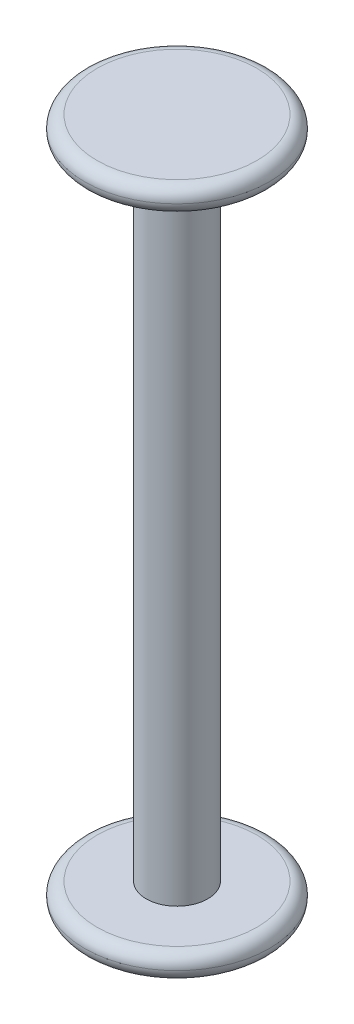
ISO-10303-21;
HEADER;
FILE_DESCRIPTION(('STEP AP214'),'2;1');
FILE_NAME('part.step','',(''),(''),'','','');
FILE_SCHEMA(('AUTOMOTIVE_DESIGN { 1 0 10303 214 1 1 1 1 }'));
ENDSEC;
DATA;
#1=APPLICATION_CONTEXT('core data for automotive mechanical design processes');
#2=APPLICATION_PROTOCOL_DEFINITION('international standard','automotive_design',2000,#1);
#3=PRODUCT_CONTEXT('',#1,'mechanical');
#4=PRODUCT('Part','Part','',(#3));
#5=PRODUCT_RELATED_PRODUCT_CATEGORY('part','',(#4));
#6=PRODUCT_DEFINITION_FORMATION('','',#4);
#7=PRODUCT_DEFINITION_CONTEXT('part definition',#1,'design');
#8=PRODUCT_DEFINITION('design','',#6,#7);
#9=PRODUCT_DEFINITION_SHAPE('','',#8);
#10=(LENGTH_UNIT() NAMED_UNIT(*) SI_UNIT(.MILLI.,.METRE.));
#11=(NAMED_UNIT(*) PLANE_ANGLE_UNIT() SI_UNIT($,.RADIAN.));
#12=(NAMED_UNIT(*) SI_UNIT($,.STERADIAN.) SOLID_ANGLE_UNIT());
#13=UNCERTAINTY_MEASURE_WITH_UNIT(LENGTH_MEASURE(1.E-05),#10,'distance_accuracy_value','');
#14=(GEOMETRIC_REPRESENTATION_CONTEXT(3) GLOBAL_UNCERTAINTY_ASSIGNED_CONTEXT((#13)) GLOBAL_UNIT_ASSIGNED_CONTEXT((#10,
#11,#12)) REPRESENTATION_CONTEXT('',''));
#15=CARTESIAN_POINT('',(0.,0.,0.));
#16=DIRECTION('',(0.,0.,1.));
#17=DIRECTION('',(1.,0.,0.));
#18=AXIS2_PLACEMENT_3D('',#15,#16,#17);
#19=CARTESIAN_POINT('',(0.,26.,0.));
#20=DIRECTION('',(0.,-1.,0.));
#21=DIRECTION('',(0.,0.,-1.));
#22=AXIS2_PLACEMENT_3D('',#19,#20,#21);
#23=CYLINDRICAL_SURFACE('',#22,2.5);
#24=CARTESIAN_POINT('',(0.,26.,0.));
#25=DIRECTION('',(0.,1.,0.));
#26=DIRECTION('',(0.,0.,1.));
#27=AXIS2_PLACEMENT_3D('',#24,#25,#26);
#28=CIRCLE('',#27,2.5);
#29=CARTESIAN_POINT('',(0.,26.,-2.5));
#30=VERTEX_POINT('',#29);
#31=EDGE_CURVE('E43',#30,#30,#28,.T.);
#32=CARTESIAN_POINT('',(0.,-26.,0.));
#33=DIRECTION('',(0.,1.,0.));
#34=DIRECTION('',(0.,0.,1.));
#35=AXIS2_PLACEMENT_3D('',#32,#33,#34);
#36=CIRCLE('',#35,2.5);
#37=CARTESIAN_POINT('',(0.,-26.,-2.5));
#38=VERTEX_POINT('',#37);
#39=EDGE_CURVE('E51',#38,#38,#36,.T.);
#40=CARTESIAN_POINT('',(0.,26.,-2.5));
#41=CARTESIAN_POINT('',(0.,25.4583333333333,-2.5));
#42=CARTESIAN_POINT('',(0.,24.9166666666667,-2.5));
#43=CARTESIAN_POINT('',(0.,23.8333333333333,-2.5));
#44=CARTESIAN_POINT('',(0.,23.2916666666667,-2.5));
#45=CARTESIAN_POINT('',(0.,22.2083333333333,-2.5));
#46=CARTESIAN_POINT('',(0.,21.6666666666667,-2.5));
#47=CARTESIAN_POINT('',(0.,20.5833333333333,-2.5));
#48=CARTESIAN_POINT('',(0.,20.0416666666667,-2.5));
#49=CARTESIAN_POINT('',(0.,18.9583333333333,-2.5));
#50=CARTESIAN_POINT('',(0.,18.4166666666667,-2.5));
#51=CARTESIAN_POINT('',(0.,17.3333333333333,-2.5));
#52=CARTESIAN_POINT('',(0.,16.7916666666667,-2.5));
#53=CARTESIAN_POINT('',(0.,15.7083333333333,-2.5));
#54=CARTESIAN_POINT('',(0.,15.1666666666667,-2.5));
#55=CARTESIAN_POINT('',(0.,14.0833333333333,-2.5));
#56=CARTESIAN_POINT('',(0.,13.5416666666667,-2.5));
#57=CARTESIAN_POINT('',(0.,12.4583333333333,-2.5));
#58=CARTESIAN_POINT('',(0.,11.9166666666667,-2.5));
#59=CARTESIAN_POINT('',(0.,10.8333333333333,-2.5));
#60=CARTESIAN_POINT('',(0.,10.2916666666667,-2.5));
#61=CARTESIAN_POINT('',(0.,9.20833333333333,-2.5));
#62=CARTESIAN_POINT('',(0.,8.66666666666667,-2.5));
#63=CARTESIAN_POINT('',(0.,7.58333333333333,-2.5));
#64=CARTESIAN_POINT('',(0.,7.04166666666667,-2.5));
#65=CARTESIAN_POINT('',(0.,5.95833333333333,-2.5));
#66=CARTESIAN_POINT('',(0.,5.41666666666667,-2.5));
#67=CARTESIAN_POINT('',(0.,4.33333333333333,-2.5));
#68=CARTESIAN_POINT('',(0.,3.79166666666667,-2.5));
#69=CARTESIAN_POINT('',(0.,2.70833333333333,-2.5));
#70=CARTESIAN_POINT('',(0.,2.16666666666667,-2.5));
#71=CARTESIAN_POINT('',(0.,1.08333333333333,-2.5));
#72=CARTESIAN_POINT('',(0.,0.541666666666667,-2.5));
#73=CARTESIAN_POINT('',(0.,-0.541666666666667,-2.5));
#74=CARTESIAN_POINT('',(0.,-1.08333333333333,-2.5));
#75=CARTESIAN_POINT('',(0.,-2.16666666666667,-2.5));
#76=CARTESIAN_POINT('',(0.,-2.70833333333333,-2.5));
#77=CARTESIAN_POINT('',(0.,-3.79166666666667,-2.5));
#78=CARTESIAN_POINT('',(0.,-4.33333333333333,-2.5));
#79=CARTESIAN_POINT('',(0.,-5.41666666666667,-2.5));
#80=CARTESIAN_POINT('',(0.,-5.95833333333333,-2.5));
#81=CARTESIAN_POINT('',(0.,-7.04166666666666,-2.5));
#82=CARTESIAN_POINT('',(0.,-7.58333333333333,-2.5));
#83=CARTESIAN_POINT('',(0.,-8.66666666666666,-2.5));
#84=CARTESIAN_POINT('',(0.,-9.20833333333333,-2.5));
#85=CARTESIAN_POINT('',(0.,-10.2916666666667,-2.5));
#86=CARTESIAN_POINT('',(0.,-10.8333333333333,-2.5));
#87=CARTESIAN_POINT('',(0.,-11.9166666666667,-2.5));
#88=CARTESIAN_POINT('',(0.,-12.4583333333333,-2.5));
#89=CARTESIAN_POINT('',(0.,-13.5416666666667,-2.5));
#90=CARTESIAN_POINT('',(0.,-14.0833333333333,-2.5));
#91=CARTESIAN_POINT('',(0.,-15.1666666666667,-2.5));
#92=CARTESIAN_POINT('',(0.,-15.7083333333333,-2.5));
#93=CARTESIAN_POINT('',(0.,-16.7916666666667,-2.5));
#94=CARTESIAN_POINT('',(0.,-17.3333333333333,-2.5));
#95=CARTESIAN_POINT('',(0.,-18.4166666666667,-2.5));
#96=CARTESIAN_POINT('',(0.,-18.9583333333333,-2.5));
#97=CARTESIAN_POINT('',(0.,-20.0416666666667,-2.5));
#98=CARTESIAN_POINT('',(0.,-20.5833333333333,-2.5));
#99=CARTESIAN_POINT('',(0.,-21.6666666666667,-2.5));
#100=CARTESIAN_POINT('',(0.,-22.2083333333333,-2.5));
#101=CARTESIAN_POINT('',(0.,-23.2916666666667,-2.5));
#102=CARTESIAN_POINT('',(0.,-23.8333333333333,-2.5));
#103=CARTESIAN_POINT('',(0.,-24.9166666666667,-2.5));
#104=CARTESIAN_POINT('',(0.,-25.4583333333333,-2.5));
#105=CARTESIAN_POINT('',(0.,-26.,-2.5));
#106=B_SPLINE_CURVE_WITH_KNOTS('',3,(#40,#41,#42,#43,#44,#45,#46,#47,#48,#49,#50,#51,#52,#53,
#54,#55,#56,#57,#58,#59,#60,#61,#62,#63,#64,#65,#66,#67,#68,#69,#70,#71,#72,#73,#74,#75,#76,#77,
#78,#79,#80,#81,#82,#83,#84,#85,#86,#87,#88,#89,#90,#91,#92,#93,#94,#95,#96,#97,#98,#99,#100,
#101,#102,#103,#104,#105),.UNSPECIFIED.,.F.,.F.,(4,2,2,2,2,2,2,2,2,2,2,2,2,2,2,2,2,2,2,2,2,2,2,
2,2,2,2,2,2,2,2,2,4),(0.,1.625,3.25,4.875,6.5,8.125,9.75,11.375,13.,14.625,16.25,17.875,19.5,
21.125,22.75,24.375,26.,27.625,29.25,30.875,32.5,34.125,35.75,37.375,39.,40.625,42.25,43.875,
45.5,47.125,48.75,50.375,52.),.UNSPECIFIED.);
#107=EDGE_CURVE('BSEAM31',#30,#38,#106,.T.);
#108=ORIENTED_EDGE('',*,*,#31,.F.);
#109=ORIENTED_EDGE('',*,*,#39,.T.);
#110=ORIENTED_EDGE('',*,*,#107,.T.);
#111=ORIENTED_EDGE('',*,*,#107,.F.);
#112=EDGE_LOOP('',(#108,#110,#109,#111));
#113=FACE_BOUND('',#112,.T.);
#114=ADVANCED_FACE('F31',(#113),#23,.T.);
#115=CARTESIAN_POINT('',(0.,28.,0.));
#116=DIRECTION('',(0.,1.,0.));
#117=DIRECTION('',(0.,0.,1.));
#118=AXIS2_PLACEMENT_3D('',#115,#116,#117);
#119=PLANE('',#118);
#120=CARTESIAN_POINT('',(0.,28.,0.));
#121=DIRECTION('',(0.,1.,0.));
#122=DIRECTION('',(0.,0.,1.));
#123=AXIS2_PLACEMENT_3D('',#120,#121,#122);
#124=CIRCLE('',#123,6.5);
#125=CARTESIAN_POINT('',(0.,28.,6.5));
#126=VERTEX_POINT('',#125);
#127=EDGE_CURVE('E39',#126,#126,#124,.T.);
#128=ORIENTED_EDGE('',*,*,#127,.T.);
#129=EDGE_LOOP('',(#128));
#130=FACE_BOUND('',#129,.T.);
#131=ADVANCED_FACE('F81',(#130),#119,.T.);
#132=CARTESIAN_POINT('',(0.,26.,0.));
#133=DIRECTION('',(0.,1.,0.));
#134=DIRECTION('',(0.,0.,1.));
#135=AXIS2_PLACEMENT_3D('',#132,#133,#134);
#136=PLANE('',#135);
#137=CARTESIAN_POINT('',(0.,26.,0.));
#138=DIRECTION('',(0.,1.,0.));
#139=DIRECTION('',(0.,0.,1.));
#140=AXIS2_PLACEMENT_3D('',#137,#138,#139);
#141=CIRCLE('',#140,6.5);
#142=CARTESIAN_POINT('',(0.,26.,6.5));
#143=VERTEX_POINT('',#142);
#144=EDGE_CURVE('E10',#143,#143,#141,.F.);
#145=ORIENTED_EDGE('',*,*,#144,.T.);
#146=EDGE_LOOP('',(#145));
#147=FACE_BOUND('',#146,.T.);
#148=ORIENTED_EDGE('',*,*,#31,.T.);
#149=EDGE_LOOP('',(#148));
#150=FACE_BOUND('',#149,.T.);
#151=ADVANCED_FACE('F87',(#147,#150),#136,.F.);
#152=CARTESIAN_POINT('',(0.,27.,0.));
#153=DIRECTION('',(0.,1.,0.));
#154=DIRECTION('',(0.,0.,1.));
#155=AXIS2_PLACEMENT_3D('',#152,#153,#154);
#156=TOROIDAL_SURFACE('',#155,6.5,1.);
#157=ORIENTED_EDGE('',*,*,#144,.F.);
#158=EDGE_LOOP('',(#157));
#159=FACE_BOUND('',#158,.T.);
#160=CARTESIAN_POINT('',(0.,27.,0.));
#161=DIRECTION('',(0.,1.,0.));
#162=DIRECTION('',(0.,0.,1.));
#163=AXIS2_PLACEMENT_3D('',#160,#161,#162);
#164=CIRCLE('',#163,7.5);
#165=CARTESIAN_POINT('',(0.,27.,7.5));
#166=VERTEX_POINT('',#165);
#167=EDGE_CURVE('E35',#166,#166,#164,.T.);
#168=ORIENTED_EDGE('',*,*,#167,.F.);
#169=EDGE_LOOP('',(#168));
#170=FACE_BOUND('',#169,.T.);
#171=ADVANCED_FACE('F33',(#159,#170),#156,.T.);
#172=CARTESIAN_POINT('',(0.,27.,0.));
#173=DIRECTION('',(0.,1.,0.));
#174=DIRECTION('',(0.,0.,1.));
#175=AXIS2_PLACEMENT_3D('',#172,#173,#174);
#176=TOROIDAL_SURFACE('',#175,6.5,1.);
#177=ORIENTED_EDGE('',*,*,#167,.T.);
#178=EDGE_LOOP('',(#177));
#179=FACE_BOUND('',#178,.T.);
#180=ORIENTED_EDGE('',*,*,#127,.F.);
#181=EDGE_LOOP('',(#180));
#182=FACE_BOUND('',#181,.T.);
#183=ADVANCED_FACE('F75',(#179,#182),#176,.T.);
#184=CARTESIAN_POINT('',(0.,-28.,0.));
#185=DIRECTION('',(0.,-1.,0.));
#186=DIRECTION('',(0.,0.,1.));
#187=AXIS2_PLACEMENT_3D('',#184,#185,#186);
#188=PLANE('',#187);
#189=CARTESIAN_POINT('',(0.,-28.,0.));
#190=DIRECTION('',(0.,1.,0.));
#191=DIRECTION('',(0.,0.,1.));
#192=AXIS2_PLACEMENT_3D('',#189,#190,#191);
#193=CIRCLE('',#192,6.5);
#194=CARTESIAN_POINT('',(0.,-28.,6.5));
#195=VERTEX_POINT('',#194);
#196=EDGE_CURVE('E55',#195,#195,#193,.T.);
#197=ORIENTED_EDGE('',*,*,#196,.F.);
#198=EDGE_LOOP('',(#197));
#199=FACE_BOUND('',#198,.T.);
#200=ADVANCED_FACE('F65',(#199),#188,.T.);
#201=CARTESIAN_POINT('',(0.,-26.,0.));
#202=DIRECTION('',(0.,-1.,0.));
#203=DIRECTION('',(0.,0.,1.));
#204=AXIS2_PLACEMENT_3D('',#201,#202,#203);
#205=PLANE('',#204);
#206=CARTESIAN_POINT('',(0.,-26.,0.));
#207=DIRECTION('',(0.,1.,0.));
#208=DIRECTION('',(0.,0.,1.));
#209=AXIS2_PLACEMENT_3D('',#206,#207,#208);
#210=CIRCLE('',#209,6.5);
#211=CARTESIAN_POINT('',(0.,-26.,6.5));
#212=VERTEX_POINT('',#211);
#213=EDGE_CURVE('E52',#212,#212,#210,.F.);
#214=ORIENTED_EDGE('',*,*,#213,.F.);
#215=EDGE_LOOP('',(#214));
#216=FACE_BOUND('',#215,.T.);
#217=ORIENTED_EDGE('',*,*,#39,.F.);
#218=EDGE_LOOP('',(#217));
#219=FACE_BOUND('',#218,.T.);
#220=ADVANCED_FACE('F62',(#216,#219),#205,.F.);
#221=CARTESIAN_POINT('',(0.,-27.,0.));
#222=DIRECTION('',(0.,-1.,0.));
#223=DIRECTION('',(0.,0.,1.));
#224=AXIS2_PLACEMENT_3D('',#221,#222,#223);
#225=TOROIDAL_SURFACE('',#224,6.5,1.);
#226=ORIENTED_EDGE('',*,*,#213,.T.);
#227=EDGE_LOOP('',(#226));
#228=FACE_BOUND('',#227,.T.);
#229=CARTESIAN_POINT('',(0.,-27.,0.));
#230=DIRECTION('',(0.,1.,0.));
#231=DIRECTION('',(0.,0.,1.));
#232=AXIS2_PLACEMENT_3D('',#229,#230,#231);
#233=CIRCLE('',#232,7.5);
#234=CARTESIAN_POINT('',(0.,-27.,7.5));
#235=VERTEX_POINT('',#234);
#236=EDGE_CURVE('E48',#235,#235,#233,.T.);
#237=ORIENTED_EDGE('',*,*,#236,.T.);
#238=EDGE_LOOP('',(#237));
#239=FACE_BOUND('',#238,.T.);
#240=ADVANCED_FACE('F64',(#228,#239),#225,.T.);
#241=CARTESIAN_POINT('',(0.,-27.,0.));
#242=DIRECTION('',(0.,-1.,0.));
#243=DIRECTION('',(0.,0.,1.));
#244=AXIS2_PLACEMENT_3D('',#241,#242,#243);
#245=TOROIDAL_SURFACE('',#244,6.5,1.);
#246=ORIENTED_EDGE('',*,*,#236,.F.);
#247=EDGE_LOOP('',(#246));
#248=FACE_BOUND('',#247,.T.);
#249=ORIENTED_EDGE('',*,*,#196,.T.);
#250=EDGE_LOOP('',(#249));
#251=FACE_BOUND('',#250,.T.);
#252=ADVANCED_FACE('F72',(#248,#251),#245,.T.);
#253=CLOSED_SHELL('',(#114,#131,#151,#171,#183,#200,#220,#240,#252));
#254=MANIFOLD_SOLID_BREP('B2',#253);
#255=ADVANCED_BREP_SHAPE_REPRESENTATION('',(#18,#254),#14);
#256=SHAPE_DEFINITION_REPRESENTATION(#9,#255);
ENDSEC;
END-ISO-10303-21;
